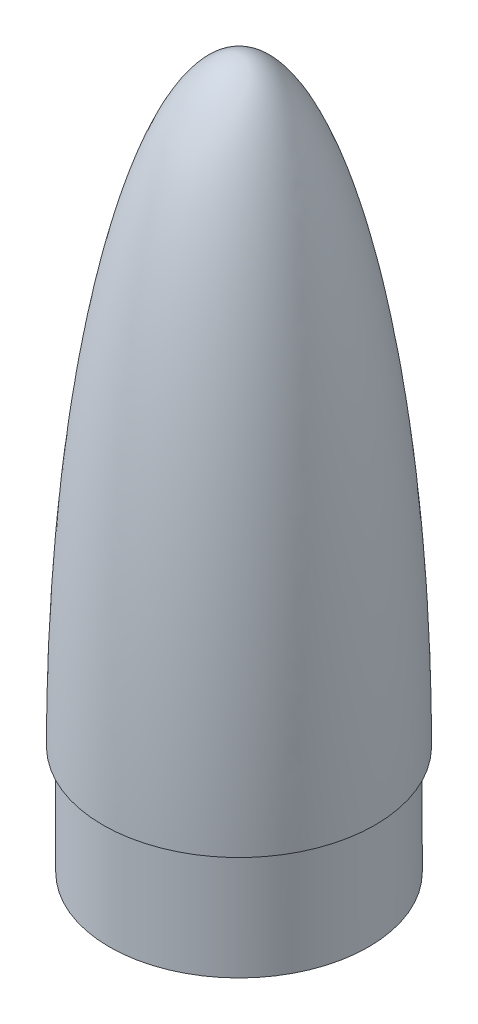
ISO-10303-21;
HEADER;
FILE_DESCRIPTION(('STEP AP214'),'2;1');
FILE_NAME('part.step','',(''),(''),'','','');
FILE_SCHEMA(('AUTOMOTIVE_DESIGN { 1 0 10303 214 1 1 1 1 }'));
ENDSEC;
DATA;
#1=APPLICATION_CONTEXT('core data for automotive mechanical design processes');
#2=APPLICATION_PROTOCOL_DEFINITION('international standard','automotive_design',2000,#1);
#3=PRODUCT_CONTEXT('',#1,'mechanical');
#4=PRODUCT('Part','Part','',(#3));
#5=PRODUCT_RELATED_PRODUCT_CATEGORY('part','',(#4));
#6=PRODUCT_DEFINITION_FORMATION('','',#4);
#7=PRODUCT_DEFINITION_CONTEXT('part definition',#1,'design');
#8=PRODUCT_DEFINITION('design','',#6,#7);
#9=PRODUCT_DEFINITION_SHAPE('','',#8);
#10=(LENGTH_UNIT() NAMED_UNIT(*) SI_UNIT(.MILLI.,.METRE.));
#11=(NAMED_UNIT(*) PLANE_ANGLE_UNIT() SI_UNIT($,.RADIAN.));
#12=(NAMED_UNIT(*) SI_UNIT($,.STERADIAN.) SOLID_ANGLE_UNIT());
#13=UNCERTAINTY_MEASURE_WITH_UNIT(LENGTH_MEASURE(1.E-05),#10,'distance_accuracy_value','');
#14=(GEOMETRIC_REPRESENTATION_CONTEXT(3) GLOBAL_UNCERTAINTY_ASSIGNED_CONTEXT((#13)) GLOBAL_UNIT_ASSIGNED_CONTEXT((#10,
#11,#12)) REPRESENTATION_CONTEXT('',''));
#15=CARTESIAN_POINT('',(0.,0.,0.));
#16=DIRECTION('',(0.,0.,1.));
#17=DIRECTION('',(1.,0.,0.));
#18=AXIS2_PLACEMENT_3D('',#15,#16,#17);
#19=CARTESIAN_POINT('',(0.,0.,0.));
#20=DIRECTION('',(0.,0.,1.));
#21=DIRECTION('',(0.,-1.,0.));
#22=AXIS2_PLACEMENT_3D('',#19,#20,#21);
#23=ELLIPSE('',#22,110.,25.);
#24=TRIMMED_CURVE('',#23,(PARAMETER_VALUE(0.)),(PARAMETER_VALUE(3.14159265358979)),.T.,.PARAMETER.);
#25=CARTESIAN_POINT('',(0.,110.,0.));
#26=DIRECTION('',(0.,1.,0.));
#27=AXIS1_PLACEMENT('',#25,#26);
#28=SURFACE_OF_REVOLUTION('',#24,#27);
#29=CARTESIAN_POINT('',(0.,110.,0.));
#30=VERTEX_POINT('',#29);
#31=VERTEX_LOOP('',#30);
#32=FACE_BOUND('',#31,.T.);
#33=CARTESIAN_POINT('',(0.,0.,0.));
#34=DIRECTION('',(0.,1.,0.));
#35=DIRECTION('',(0.,0.,1.));
#36=AXIS2_PLACEMENT_3D('',#33,#34,#35);
#37=CIRCLE('',#36,25.);
#38=CARTESIAN_POINT('',(0.,0.,25.));
#39=VERTEX_POINT('',#38);
#40=EDGE_CURVE('E42',#39,#39,#37,.T.);
#41=ORIENTED_EDGE('',*,*,#40,.T.);
#42=EDGE_LOOP('',(#41));
#43=FACE_BOUND('',#42,.T.);
#44=ADVANCED_FACE('F35',(#32,#43),#28,.T.);
#45=CARTESIAN_POINT('',(0.,0.,0.));
#46=DIRECTION('',(0.,1.,0.));
#47=DIRECTION('',(0.,0.,1.));
#48=AXIS2_PLACEMENT_3D('',#45,#46,#47);
#49=PLANE('',#48);
#50=CARTESIAN_POINT('',(0.,0.,0.));
#51=DIRECTION('',(0.,1.,0.));
#52=DIRECTION('',(0.,0.,1.));
#53=AXIS2_PLACEMENT_3D('',#50,#51,#52);
#54=CIRCLE('',#53,23.8);
#55=CARTESIAN_POINT('',(0.,0.,23.8));
#56=VERTEX_POINT('',#55);
#57=EDGE_CURVE('E11',#56,#56,#54,.F.);
#58=ORIENTED_EDGE('',*,*,#57,.F.);
#59=EDGE_LOOP('',(#58));
#60=FACE_BOUND('',#59,.T.);
#61=ORIENTED_EDGE('',*,*,#40,.F.);
#62=EDGE_LOOP('',(#61));
#63=FACE_BOUND('',#62,.T.);
#64=ADVANCED_FACE('F47',(#60,#63),#49,.F.);
#65=CARTESIAN_POINT('',(0.,-20.,0.));
#66=DIRECTION('',(0.,1.,0.));
#67=DIRECTION('',(0.,0.,1.));
#68=AXIS2_PLACEMENT_3D('',#65,#66,#67);
#69=CYLINDRICAL_SURFACE('',#68,23.8);
#70=CARTESIAN_POINT('',(0.,-20.,0.));
#71=DIRECTION('',(0.,-1.,0.));
#72=DIRECTION('',(0.,0.,-1.));
#73=AXIS2_PLACEMENT_3D('',#70,#71,#72);
#74=CIRCLE('',#73,23.8);
#75=CARTESIAN_POINT('',(0.,-20.,-23.8));
#76=VERTEX_POINT('',#75);
#77=EDGE_CURVE('E51',#76,#76,#74,.T.);
#78=ORIENTED_EDGE('',*,*,#77,.F.);
#79=EDGE_LOOP('',(#78));
#80=FACE_BOUND('',#79,.T.);
#81=ORIENTED_EDGE('',*,*,#57,.T.);
#82=EDGE_LOOP('',(#81));
#83=FACE_BOUND('',#82,.T.);
#84=ADVANCED_FACE('F59',(#80,#83),#69,.T.);
#85=CARTESIAN_POINT('',(0.,-20.,0.));
#86=DIRECTION('',(0.,-1.,0.));
#87=DIRECTION('',(0.,0.,-1.));
#88=AXIS2_PLACEMENT_3D('',#85,#86,#87);
#89=PLANE('',#88);
#90=ORIENTED_EDGE('',*,*,#77,.T.);
#91=EDGE_LOOP('',(#90));
#92=FACE_BOUND('',#91,.T.);
#93=ADVANCED_FACE('F57',(#92),#89,.T.);
#94=CLOSED_SHELL('',(#44,#64,#84,#93));
#95=MANIFOLD_SOLID_BREP('B2',#94);
#96=ADVANCED_BREP_SHAPE_REPRESENTATION('',(#18,#95),#14);
#97=SHAPE_DEFINITION_REPRESENTATION(#9,#96);
ENDSEC;
END-ISO-10303-21;
